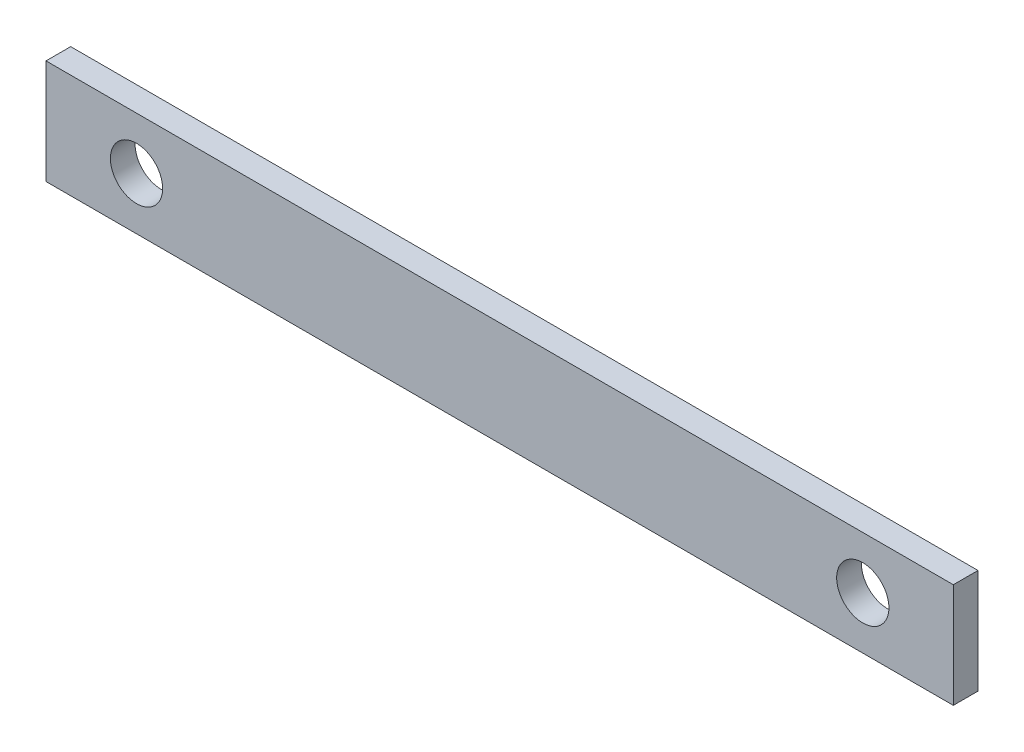
ISO-10303-21;
HEADER;
FILE_DESCRIPTION(('STEP AP214'),'2;1');
FILE_NAME('part.step','',(''),(''),'','','');
FILE_SCHEMA(('AUTOMOTIVE_DESIGN { 1 0 10303 214 1 1 1 1 }'));
ENDSEC;
DATA;
#1=APPLICATION_CONTEXT('core data for automotive mechanical design processes');
#2=APPLICATION_PROTOCOL_DEFINITION('international standard','automotive_design',2000,#1);
#3=PRODUCT_CONTEXT('',#1,'mechanical');
#4=PRODUCT('Part','Part','',(#3));
#5=PRODUCT_RELATED_PRODUCT_CATEGORY('part','',(#4));
#6=PRODUCT_DEFINITION_FORMATION('','',#4);
#7=PRODUCT_DEFINITION_CONTEXT('part definition',#1,'design');
#8=PRODUCT_DEFINITION('design','',#6,#7);
#9=PRODUCT_DEFINITION_SHAPE('','',#8);
#10=(LENGTH_UNIT() NAMED_UNIT(*) SI_UNIT(.MILLI.,.METRE.));
#11=(NAMED_UNIT(*) PLANE_ANGLE_UNIT() SI_UNIT($,.RADIAN.));
#12=(NAMED_UNIT(*) SI_UNIT($,.STERADIAN.) SOLID_ANGLE_UNIT());
#13=UNCERTAINTY_MEASURE_WITH_UNIT(LENGTH_MEASURE(1.E-05),#10,'distance_accuracy_value','');
#14=(GEOMETRIC_REPRESENTATION_CONTEXT(3) GLOBAL_UNCERTAINTY_ASSIGNED_CONTEXT((#13)) GLOBAL_UNIT_ASSIGNED_CONTEXT((#10,
#11,#12)) REPRESENTATION_CONTEXT('',''));
#15=CARTESIAN_POINT('',(0.,0.,0.));
#16=DIRECTION('',(0.,0.,1.));
#17=DIRECTION('',(1.,0.,0.));
#18=AXIS2_PLACEMENT_3D('',#15,#16,#17);
#19=CARTESIAN_POINT('',(0.,0.,3.));
#20=DIRECTION('',(0.,0.,1.));
#21=DIRECTION('',(1.,0.,0.));
#22=AXIS2_PLACEMENT_3D('',#19,#20,#21);
#23=PLANE('',#22);
#24=CARTESIAN_POINT('',(44.13,0.,3.));
#25=DIRECTION('',(0.,0.,1.));
#26=DIRECTION('',(1.,0.,0.));
#27=AXIS2_PLACEMENT_3D('',#24,#25,#26);
#28=CIRCLE('',#27,3.175);
#29=CARTESIAN_POINT('',(47.305,0.,3.));
#30=VERTEX_POINT('',#29);
#31=EDGE_CURVE('E100',#30,#30,#28,.T.);
#32=ORIENTED_EDGE('',*,*,#31,.F.);
#33=EDGE_LOOP('',(#32));
#34=FACE_BOUND('',#33,.T.);
#35=DIRECTION('',(0.,-1.,0.));
#36=VECTOR('',#35,1.);
#37=CARTESIAN_POINT('',(-55.13,-6.35000000000001,3.));
#38=LINE('',#37,#36);
#39=CARTESIAN_POINT('',(-55.13,6.34999999999999,3.));
#40=VERTEX_POINT('',#39);
#41=CARTESIAN_POINT('',(-55.13,-6.35000000000001,3.));
#42=VERTEX_POINT('',#41);
#43=EDGE_CURVE('E85',#40,#42,#38,.T.);
#44=ORIENTED_EDGE('',*,*,#43,.T.);
#45=DIRECTION('',(1.,0.,0.));
#46=VECTOR('',#45,1.);
#47=CARTESIAN_POINT('',(55.13,-6.34999999999999,3.));
#48=LINE('',#47,#46);
#49=CARTESIAN_POINT('',(55.13,-6.34999999999999,3.));
#50=VERTEX_POINT('',#49);
#51=EDGE_CURVE('E80',#42,#50,#48,.T.);
#52=ORIENTED_EDGE('',*,*,#51,.T.);
#53=DIRECTION('',(0.,1.,0.));
#54=VECTOR('',#53,1.);
#55=CARTESIAN_POINT('',(55.13,-6.34999999999999,3.));
#56=LINE('',#55,#54);
#57=CARTESIAN_POINT('',(55.13,6.35000000000001,3.));
#58=VERTEX_POINT('',#57);
#59=EDGE_CURVE('E83',#50,#58,#56,.T.);
#60=ORIENTED_EDGE('',*,*,#59,.T.);
#61=DIRECTION('',(-1.,0.,0.));
#62=VECTOR('',#61,1.);
#63=CARTESIAN_POINT('',(55.13,6.35000000000001,3.));
#64=LINE('',#63,#62);
#65=EDGE_CURVE('E50',#58,#40,#64,.T.);
#66=ORIENTED_EDGE('',*,*,#65,.T.);
#67=EDGE_LOOP('',(#44,#52,#60,#66));
#68=FACE_BOUND('',#67,.T.);
#69=CARTESIAN_POINT('',(-44.13,0.,3.));
#70=DIRECTION('',(0.,0.,1.));
#71=DIRECTION('',(-1.,0.,0.));
#72=AXIS2_PLACEMENT_3D('',#69,#70,#71);
#73=CIRCLE('',#72,3.175);
#74=CARTESIAN_POINT('',(-47.305,0.,3.));
#75=VERTEX_POINT('',#74);
#76=EDGE_CURVE('E115',#75,#75,#73,.T.);
#77=ORIENTED_EDGE('',*,*,#76,.F.);
#78=EDGE_LOOP('',(#77));
#79=FACE_BOUND('',#78,.T.);
#80=ADVANCED_FACE('F33',(#34,#68,#79),#23,.T.);
#81=CARTESIAN_POINT('',(0.,0.,0.));
#82=DIRECTION('',(0.,0.,1.));
#83=DIRECTION('',(1.,0.,0.));
#84=AXIS2_PLACEMENT_3D('',#81,#82,#83);
#85=PLANE('',#84);
#86=DIRECTION('',(0.,-1.,0.));
#87=VECTOR('',#86,1.);
#88=CARTESIAN_POINT('',(-55.13,-6.35000000000001,0.));
#89=LINE('',#88,#87);
#90=CARTESIAN_POINT('',(-55.13,6.34999999999999,0.));
#91=VERTEX_POINT('',#90);
#92=CARTESIAN_POINT('',(-55.13,-6.35000000000001,0.));
#93=VERTEX_POINT('',#92);
#94=EDGE_CURVE('E97',#91,#93,#89,.T.);
#95=ORIENTED_EDGE('',*,*,#94,.F.);
#96=DIRECTION('',(-1.,0.,0.));
#97=VECTOR('',#96,1.);
#98=CARTESIAN_POINT('',(55.13,6.35000000000001,0.));
#99=LINE('',#98,#97);
#100=CARTESIAN_POINT('',(55.13,6.35000000000001,0.));
#101=VERTEX_POINT('',#100);
#102=EDGE_CURVE('E73',#101,#91,#99,.T.);
#103=ORIENTED_EDGE('',*,*,#102,.F.);
#104=DIRECTION('',(0.,1.,0.));
#105=VECTOR('',#104,1.);
#106=CARTESIAN_POINT('',(55.13,-6.34999999999999,0.));
#107=LINE('',#106,#105);
#108=CARTESIAN_POINT('',(55.13,-6.34999999999999,0.));
#109=VERTEX_POINT('',#108);
#110=EDGE_CURVE('E67',#109,#101,#107,.T.);
#111=ORIENTED_EDGE('',*,*,#110,.F.);
#112=DIRECTION('',(1.,0.,0.));
#113=VECTOR('',#112,1.);
#114=CARTESIAN_POINT('',(55.13,-6.34999999999999,0.));
#115=LINE('',#114,#113);
#116=EDGE_CURVE('E89',#93,#109,#115,.T.);
#117=ORIENTED_EDGE('',*,*,#116,.F.);
#118=EDGE_LOOP('',(#95,#103,#111,#117));
#119=FACE_BOUND('',#118,.T.);
#120=CARTESIAN_POINT('',(44.13,0.,0.));
#121=DIRECTION('',(0.,0.,1.));
#122=DIRECTION('',(1.,0.,0.));
#123=AXIS2_PLACEMENT_3D('',#120,#121,#122);
#124=CIRCLE('',#123,3.175);
#125=CARTESIAN_POINT('',(47.305,0.,0.));
#126=VERTEX_POINT('',#125);
#127=EDGE_CURVE('E112',#126,#126,#124,.T.);
#128=ORIENTED_EDGE('',*,*,#127,.T.);
#129=EDGE_LOOP('',(#128));
#130=FACE_BOUND('',#129,.T.);
#131=CARTESIAN_POINT('',(-44.13,0.,0.));
#132=DIRECTION('',(0.,0.,1.));
#133=DIRECTION('',(-1.,0.,0.));
#134=AXIS2_PLACEMENT_3D('',#131,#132,#133);
#135=CIRCLE('',#134,3.175);
#136=CARTESIAN_POINT('',(-47.305,0.,0.));
#137=VERTEX_POINT('',#136);
#138=EDGE_CURVE('E118',#137,#137,#135,.T.);
#139=ORIENTED_EDGE('',*,*,#138,.T.);
#140=EDGE_LOOP('',(#139));
#141=FACE_BOUND('',#140,.T.);
#142=ADVANCED_FACE('F108',(#119,#130,#141),#85,.F.);
#143=CARTESIAN_POINT('',(-55.13,-6.35000000000001,3.));
#144=DIRECTION('',(1.,0.,0.));
#145=DIRECTION('',(0.,0.,-1.));
#146=AXIS2_PLACEMENT_3D('',#143,#144,#145);
#147=PLANE('',#146);
#148=ORIENTED_EDGE('',*,*,#94,.T.);
#149=DIRECTION('',(0.,0.,-1.));
#150=VECTOR('',#149,1.);
#151=CARTESIAN_POINT('',(-55.13,-6.35000000000001,3.));
#152=LINE('',#151,#150);
#153=EDGE_CURVE('E11',#42,#93,#152,.T.);
#154=ORIENTED_EDGE('',*,*,#153,.F.);
#155=ORIENTED_EDGE('',*,*,#43,.F.);
#156=DIRECTION('',(0.,0.,-1.));
#157=VECTOR('',#156,1.);
#158=CARTESIAN_POINT('',(-55.13,6.34999999999999,3.));
#159=LINE('',#158,#157);
#160=EDGE_CURVE('E93',#40,#91,#159,.T.);
#161=ORIENTED_EDGE('',*,*,#160,.T.);
#162=EDGE_LOOP('',(#148,#154,#155,#161));
#163=FACE_BOUND('',#162,.T.);
#164=ADVANCED_FACE('F35',(#163),#147,.F.);
#165=CARTESIAN_POINT('',(55.13,-6.34999999999999,3.));
#166=DIRECTION('',(0.,1.,0.));
#167=DIRECTION('',(-1.,0.,0.));
#168=AXIS2_PLACEMENT_3D('',#165,#166,#167);
#169=PLANE('',#168);
#170=ORIENTED_EDGE('',*,*,#116,.T.);
#171=DIRECTION('',(0.,0.,-1.));
#172=VECTOR('',#171,1.);
#173=CARTESIAN_POINT('',(55.13,-6.34999999999999,3.));
#174=LINE('',#173,#172);
#175=EDGE_CURVE('E42',#50,#109,#174,.T.);
#176=ORIENTED_EDGE('',*,*,#175,.F.);
#177=ORIENTED_EDGE('',*,*,#51,.F.);
#178=ORIENTED_EDGE('',*,*,#153,.T.);
#179=EDGE_LOOP('',(#170,#176,#177,#178));
#180=FACE_BOUND('',#179,.T.);
#181=ADVANCED_FACE('F88',(#180),#169,.F.);
#182=CARTESIAN_POINT('',(55.13,-6.34999999999999,3.));
#183=DIRECTION('',(-1.,0.,0.));
#184=DIRECTION('',(0.,0.,1.));
#185=AXIS2_PLACEMENT_3D('',#182,#183,#184);
#186=PLANE('',#185);
#187=ORIENTED_EDGE('',*,*,#110,.T.);
#188=DIRECTION('',(0.,0.,-1.));
#189=VECTOR('',#188,1.);
#190=CARTESIAN_POINT('',(55.13,6.35000000000001,3.));
#191=LINE('',#190,#189);
#192=EDGE_CURVE('E90',#58,#101,#191,.T.);
#193=ORIENTED_EDGE('',*,*,#192,.F.);
#194=ORIENTED_EDGE('',*,*,#59,.F.);
#195=ORIENTED_EDGE('',*,*,#175,.T.);
#196=EDGE_LOOP('',(#187,#193,#194,#195));
#197=FACE_BOUND('',#196,.T.);
#198=ADVANCED_FACE('F91',(#197),#186,.F.);
#199=CARTESIAN_POINT('',(55.13,6.35000000000001,3.));
#200=DIRECTION('',(0.,-1.,0.));
#201=DIRECTION('',(1.,0.,0.));
#202=AXIS2_PLACEMENT_3D('',#199,#200,#201);
#203=PLANE('',#202);
#204=ORIENTED_EDGE('',*,*,#102,.T.);
#205=ORIENTED_EDGE('',*,*,#160,.F.);
#206=ORIENTED_EDGE('',*,*,#65,.F.);
#207=ORIENTED_EDGE('',*,*,#192,.T.);
#208=EDGE_LOOP('',(#204,#205,#206,#207));
#209=FACE_BOUND('',#208,.T.);
#210=ADVANCED_FACE('F105',(#209),#203,.F.);
#211=CARTESIAN_POINT('',(44.13,0.,3.));
#212=DIRECTION('',(0.,0.,-1.));
#213=DIRECTION('',(-1.,0.,0.));
#214=AXIS2_PLACEMENT_3D('',#211,#212,#213);
#215=CYLINDRICAL_SURFACE('',#214,3.175);
#216=ORIENTED_EDGE('',*,*,#31,.T.);
#217=EDGE_LOOP('',(#216));
#218=FACE_BOUND('',#217,.T.);
#219=ORIENTED_EDGE('',*,*,#127,.F.);
#220=EDGE_LOOP('',(#219));
#221=FACE_BOUND('',#220,.T.);
#222=ADVANCED_FACE('F135',(#218,#221),#215,.F.);
#223=CARTESIAN_POINT('',(-44.13,0.,3.));
#224=DIRECTION('',(0.,0.,-1.));
#225=DIRECTION('',(-1.,0.,0.));
#226=AXIS2_PLACEMENT_3D('',#223,#224,#225);
#227=CYLINDRICAL_SURFACE('',#226,3.175);
#228=ORIENTED_EDGE('',*,*,#76,.T.);
#229=EDGE_LOOP('',(#228));
#230=FACE_BOUND('',#229,.T.);
#231=ORIENTED_EDGE('',*,*,#138,.F.);
#232=EDGE_LOOP('',(#231));
#233=FACE_BOUND('',#232,.T.);
#234=ADVANCED_FACE('F124',(#230,#233),#227,.F.);
#235=CLOSED_SHELL('',(#80,#142,#164,#181,#198,#210,#222,#234));
#236=MANIFOLD_SOLID_BREP('B2',#235);
#237=ADVANCED_BREP_SHAPE_REPRESENTATION('',(#18,#236),#14);
#238=SHAPE_DEFINITION_REPRESENTATION(#9,#237);
ENDSEC;
END-ISO-10303-21;
